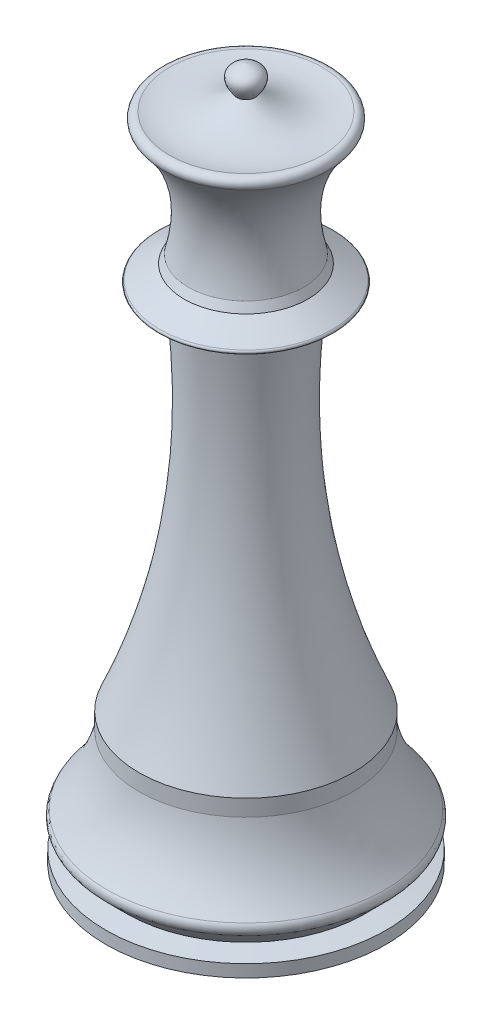
ISO-10303-21;
HEADER;
FILE_DESCRIPTION(('STEP AP214'),'2;1');
FILE_NAME('part.step','',(''),(''),'','','');
FILE_SCHEMA(('AUTOMOTIVE_DESIGN { 1 0 10303 214 1 1 1 1 }'));
ENDSEC;
DATA;
#1=APPLICATION_CONTEXT('core data for automotive mechanical design processes');
#2=APPLICATION_PROTOCOL_DEFINITION('international standard','automotive_design',2000,#1);
#3=PRODUCT_CONTEXT('',#1,'mechanical');
#4=PRODUCT('Part','Part','',(#3));
#5=PRODUCT_RELATED_PRODUCT_CATEGORY('part','',(#4));
#6=PRODUCT_DEFINITION_FORMATION('','',#4);
#7=PRODUCT_DEFINITION_CONTEXT('part definition',#1,'design');
#8=PRODUCT_DEFINITION('design','',#6,#7);
#9=PRODUCT_DEFINITION_SHAPE('','',#8);
#10=(LENGTH_UNIT() NAMED_UNIT(*) SI_UNIT(.MILLI.,.METRE.));
#11=(NAMED_UNIT(*) PLANE_ANGLE_UNIT() SI_UNIT($,.RADIAN.));
#12=(NAMED_UNIT(*) SI_UNIT($,.STERADIAN.) SOLID_ANGLE_UNIT());
#13=UNCERTAINTY_MEASURE_WITH_UNIT(LENGTH_MEASURE(1.E-05),#10,'distance_accuracy_value','');
#14=(GEOMETRIC_REPRESENTATION_CONTEXT(3) GLOBAL_UNCERTAINTY_ASSIGNED_CONTEXT((#13)) GLOBAL_UNIT_ASSIGNED_CONTEXT((#10,
#11,#12)) REPRESENTATION_CONTEXT('',''));
#15=CARTESIAN_POINT('',(0.,0.,0.));
#16=DIRECTION('',(0.,0.,1.));
#17=DIRECTION('',(1.,0.,0.));
#18=AXIS2_PLACEMENT_3D('',#15,#16,#17);
#19=CARTESIAN_POINT('',(1.13326062966833,81.,0.));
#20=CARTESIAN_POINT('',(3.02648487700527,83.4155625241193,0.));
#21=CARTESIAN_POINT('',(0.,84.,0.));
#22=B_SPLINE_CURVE_WITH_KNOTS('',2,(#19,#20,#21),.UNSPECIFIED.,.F.,.F.,(3,3),(0.,1.),.UNSPECIFIED.);
#23=CARTESIAN_POINT('',(0.,84.,0.));
#24=DIRECTION('',(0.,1.,0.));
#25=AXIS1_PLACEMENT('',#23,#24);
#26=SURFACE_OF_REVOLUTION('',#22,#25);
#27=CARTESIAN_POINT('',(0.,84.,0.));
#28=VERTEX_POINT('',#27);
#29=VERTEX_LOOP('',#28);
#30=FACE_BOUND('',#29,.T.);
#31=CARTESIAN_POINT('',(0.,81.,0.));
#32=DIRECTION('',(0.,1.,0.));
#33=DIRECTION('',(0.,0.,1.));
#34=AXIS2_PLACEMENT_3D('',#31,#32,#33);
#35=CIRCLE('',#34,1.13326062966833);
#36=CARTESIAN_POINT('',(0.,81.,1.13326062966833));
#37=VERTEX_POINT('',#36);
#38=EDGE_CURVE('E48',#37,#37,#35,.T.);
#39=ORIENTED_EDGE('',*,*,#38,.T.);
#40=EDGE_LOOP('',(#39));
#41=FACE_BOUND('',#40,.T.);
#42=ADVANCED_FACE('F32',(#30,#41),#26,.T.);
#43=CARTESIAN_POINT('',(13.,80.5,0.));
#44=CARTESIAN_POINT('',(6.49584409705784,76.7584111276341,0.));
#45=CARTESIAN_POINT('',(1.13326062966833,81.,0.));
#46=B_SPLINE_CURVE_WITH_KNOTS('',2,(#43,#44,#45),.UNSPECIFIED.,.F.,.F.,(3,3),(0.,1.),.UNSPECIFIED.);
#47=CARTESIAN_POINT('',(0.,84.,0.));
#48=DIRECTION('',(0.,1.,0.));
#49=AXIS1_PLACEMENT('',#47,#48);
#50=SURFACE_OF_REVOLUTION('',#46,#49);
#51=CARTESIAN_POINT('',(0.,78.9865391520286,0.));
#52=DIRECTION('',(0.,1.,0.));
#53=DIRECTION('',(0.,0.,1.));
#54=AXIS2_PLACEMENT_3D('',#51,#52,#53);
#55=CIRCLE('',#54,9.25895814437027);
#56=CARTESIAN_POINT('',(0.,78.9865391520286,9.25895814437027));
#57=VERTEX_POINT('',#56);
#58=EDGE_CURVE('E63',#57,#57,#55,.T.);
#59=ORIENTED_EDGE('',*,*,#58,.T.);
#60=EDGE_LOOP('',(#59));
#61=FACE_BOUND('',#60,.T.);
#62=ORIENTED_EDGE('',*,*,#38,.F.);
#63=EDGE_LOOP('',(#62));
#64=FACE_BOUND('',#63,.T.);
#65=ADVANCED_FACE('F44',(#61,#64),#50,.T.);
#66=CARTESIAN_POINT('',(7.,64.,0.));
#67=CARTESIAN_POINT('',(4.39649003097827,74.0702511156848,0.));
#68=CARTESIAN_POINT('',(13.,80.5,0.));
#69=B_SPLINE_CURVE_WITH_KNOTS('',2,(#66,#67,#68),.UNSPECIFIED.,.F.,.F.,(3,3),(0.,1.),.UNSPECIFIED.);
#70=CARTESIAN_POINT('',(0.,84.,0.));
#71=DIRECTION('',(0.,1.,0.));
#72=AXIS1_PLACEMENT('',#70,#71);
#73=SURFACE_OF_REVOLUTION('',#69,#72);
#74=CARTESIAN_POINT('',(0.,77.7576022569432,0.));
#75=DIRECTION('',(0.,1.,0.));
#76=DIRECTION('',(0.,0.,1.));
#77=AXIS2_PLACEMENT_3D('',#74,#75,#76);
#78=CIRCLE('',#77,9.98480800543243);
#79=CARTESIAN_POINT('',(0.,77.7576022569432,9.98480800543243));
#80=VERTEX_POINT('',#79);
#81=EDGE_CURVE('E66',#80,#80,#78,.F.);
#82=ORIENTED_EDGE('',*,*,#81,.T.);
#83=EDGE_LOOP('',(#82));
#84=FACE_BOUND('',#83,.T.);
#85=CARTESIAN_POINT('',(0.,64.,0.));
#86=DIRECTION('',(0.,1.,0.));
#87=DIRECTION('',(0.,0.,1.));
#88=AXIS2_PLACEMENT_3D('',#85,#86,#87);
#89=CIRCLE('',#88,7.);
#90=CARTESIAN_POINT('',(0.,64.,7.));
#91=VERTEX_POINT('',#90);
#92=EDGE_CURVE('E51',#91,#91,#89,.T.);
#93=ORIENTED_EDGE('',*,*,#92,.T.);
#94=EDGE_LOOP('',(#93));
#95=FACE_BOUND('',#94,.T.);
#96=ADVANCED_FACE('F173',(#84,#95),#73,.T.);
#97=CARTESIAN_POINT('',(0.,63.,0.));
#98=DIRECTION('',(0.,-1.,0.));
#99=DIRECTION('',(0.,0.,-1.));
#100=AXIS2_PLACEMENT_3D('',#97,#98,#99);
#101=CONICAL_SURFACE('',#100,7.5,0.463647609000805);
#102=ORIENTED_EDGE('',*,*,#92,.F.);
#103=EDGE_LOOP('',(#102));
#104=FACE_BOUND('',#103,.T.);
#105=CARTESIAN_POINT('',(0.,63.,0.));
#106=DIRECTION('',(0.,1.,0.));
#107=DIRECTION('',(0.,0.,1.));
#108=AXIS2_PLACEMENT_3D('',#105,#106,#107);
#109=CIRCLE('',#108,7.5);
#110=CARTESIAN_POINT('',(0.,63.,7.5));
#111=VERTEX_POINT('',#110);
#112=EDGE_CURVE('E57',#111,#111,#109,.T.);
#113=ORIENTED_EDGE('',*,*,#112,.T.);
#114=EDGE_LOOP('',(#113));
#115=FACE_BOUND('',#114,.T.);
#116=ADVANCED_FACE('F176',(#104,#115),#101,.T.);
#117=CARTESIAN_POINT('',(0.,61.,0.));
#118=DIRECTION('',(0.,-1.,0.));
#119=DIRECTION('',(0.,0.,-1.));
#120=AXIS2_PLACEMENT_3D('',#117,#118,#119);
#121=CONICAL_SURFACE('',#120,11.,1.05165021254837);
#122=CARTESIAN_POINT('',(0.,61.3086930111199,0.));
#123=DIRECTION('',(0.,1.,0.));
#124=DIRECTION('',(0.,0.,1.));
#125=AXIS2_PLACEMENT_3D('',#122,#123,#124);
#126=CIRCLE('',#125,10.4597872305401);
#127=CARTESIAN_POINT('',(0.,61.3086930111199,10.4597872305401));
#128=VERTEX_POINT('',#127);
#129=EDGE_CURVE('E39',#128,#128,#126,.T.);
#130=ORIENTED_EDGE('',*,*,#129,.T.);
#131=EDGE_LOOP('',(#130));
#132=FACE_BOUND('',#131,.T.);
#133=ORIENTED_EDGE('',*,*,#112,.F.);
#134=EDGE_LOOP('',(#133));
#135=FACE_BOUND('',#134,.T.);
#136=ADVANCED_FACE('F71',(#132,#135),#121,.T.);
#137=CARTESIAN_POINT('',(0.,60.,0.));
#138=DIRECTION('',(0.,1.,0.));
#139=DIRECTION('',(0.,0.,1.));
#140=AXIS2_PLACEMENT_3D('',#137,#138,#139);
#141=CONICAL_SURFACE('',#140,7.,1.32581766366803);
#142=CARTESIAN_POINT('',(0.,60.8490966005525,0.));
#143=DIRECTION('',(0.,-1.,0.));
#144=DIRECTION('',(0.,0.,-1.));
#145=AXIS2_PLACEMENT_3D('',#142,#143,#144);
#146=CIRCLE('',#145,10.39638640221);
#147=CARTESIAN_POINT('',(0.,60.8490966005525,-10.39638640221));
#148=VERTEX_POINT('',#147);
#149=EDGE_CURVE('E11',#148,#148,#146,.T.);
#150=ORIENTED_EDGE('',*,*,#149,.T.);
#151=EDGE_LOOP('',(#150));
#152=FACE_BOUND('',#151,.T.);
#153=CARTESIAN_POINT('',(0.,60.,0.));
#154=DIRECTION('',(0.,1.,0.));
#155=DIRECTION('',(0.,0.,1.));
#156=AXIS2_PLACEMENT_3D('',#153,#154,#155);
#157=CIRCLE('',#156,7.);
#158=CARTESIAN_POINT('',(0.,60.,7.));
#159=VERTEX_POINT('',#158);
#160=EDGE_CURVE('E91',#159,#159,#157,.T.);
#161=ORIENTED_EDGE('',*,*,#160,.T.);
#162=EDGE_LOOP('',(#161));
#163=FACE_BOUND('',#162,.T.);
#164=ADVANCED_FACE('F84',(#152,#163),#141,.T.);
#165=CARTESIAN_POINT('',(12.9764118594457,16.03,0.));
#166=CARTESIAN_POINT('',(4.13602827579343,36.5953595125436,0.));
#167=CARTESIAN_POINT('',(7.,60.,0.));
#168=B_SPLINE_CURVE_WITH_KNOTS('',2,(#165,#166,#167),.UNSPECIFIED.,.F.,.F.,(3,3),(0.,1.),.UNSPECIFIED.);
#169=CARTESIAN_POINT('',(0.,84.,0.));
#170=DIRECTION('',(0.,1.,0.));
#171=AXIS1_PLACEMENT('',#169,#170);
#172=SURFACE_OF_REVOLUTION('',#168,#171);
#173=ORIENTED_EDGE('',*,*,#160,.F.);
#174=EDGE_LOOP('',(#173));
#175=FACE_BOUND('',#174,.T.);
#176=CARTESIAN_POINT('',(0.,16.03,0.));
#177=DIRECTION('',(0.,1.,0.));
#178=DIRECTION('',(0.,0.,1.));
#179=AXIS2_PLACEMENT_3D('',#176,#177,#178);
#180=CIRCLE('',#179,12.9764118594457);
#181=CARTESIAN_POINT('',(0.,16.03,12.9764118594457));
#182=VERTEX_POINT('',#181);
#183=EDGE_CURVE('E93',#182,#182,#180,.T.);
#184=ORIENTED_EDGE('',*,*,#183,.T.);
#185=EDGE_LOOP('',(#184));
#186=FACE_BOUND('',#185,.T.);
#187=ADVANCED_FACE('F87',(#175,#186),#172,.T.);
#188=CARTESIAN_POINT('',(0.,84.,0.));
#189=DIRECTION('',(0.,1.,0.));
#190=DIRECTION('',(0.,0.,1.));
#191=AXIS2_PLACEMENT_3D('',#188,#189,#190);
#192=CYLINDRICAL_SURFACE('',#191,12.9764118594457);
#193=ORIENTED_EDGE('',*,*,#183,.F.);
#194=EDGE_LOOP('',(#193));
#195=FACE_BOUND('',#194,.T.);
#196=CARTESIAN_POINT('',(0.,14.03,0.));
#197=DIRECTION('',(0.,1.,0.));
#198=DIRECTION('',(0.,0.,1.));
#199=AXIS2_PLACEMENT_3D('',#196,#197,#198);
#200=CIRCLE('',#199,12.9764118594457);
#201=CARTESIAN_POINT('',(0.,14.03,12.9764118594457));
#202=VERTEX_POINT('',#201);
#203=EDGE_CURVE('E97',#202,#202,#200,.T.);
#204=ORIENTED_EDGE('',*,*,#203,.T.);
#205=EDGE_LOOP('',(#204));
#206=FACE_BOUND('',#205,.T.);
#207=ADVANCED_FACE('F142',(#195,#206),#192,.T.);
#208=CARTESIAN_POINT('',(17.5,5.,0.));
#209=CARTESIAN_POINT('',(13.9021176592597,8.73756245356651,0.));
#210=CARTESIAN_POINT('',(12.9764118594457,14.03,0.));
#211=B_SPLINE_CURVE_WITH_KNOTS('',2,(#208,#209,#210),.UNSPECIFIED.,.F.,.F.,(3,3),(0.,1.),.UNSPECIFIED.);
#212=CARTESIAN_POINT('',(0.,84.,0.));
#213=DIRECTION('',(0.,1.,0.));
#214=AXIS1_PLACEMENT('',#212,#213);
#215=SURFACE_OF_REVOLUTION('',#211,#214);
#216=CARTESIAN_POINT('',(0.,5.6861045276058,0.));
#217=DIRECTION('',(0.,1.,0.));
#218=DIRECTION('',(0.,0.,1.));
#219=AXIS2_PLACEMENT_3D('',#216,#217,#218);
#220=CIRCLE('',#219,16.8733774895661);
#221=CARTESIAN_POINT('',(0.,5.6861045276058,16.8733774895661));
#222=VERTEX_POINT('',#221);
#223=EDGE_CURVE('E50',#222,#222,#220,.T.);
#224=ORIENTED_EDGE('',*,*,#223,.T.);
#225=EDGE_LOOP('',(#224));
#226=FACE_BOUND('',#225,.T.);
#227=ORIENTED_EDGE('',*,*,#203,.F.);
#228=EDGE_LOOP('',(#227));
#229=FACE_BOUND('',#228,.T.);
#230=ADVANCED_FACE('F138',(#226,#229),#215,.T.);
#231=CARTESIAN_POINT('',(0.,1.94968869268543,0.));
#232=DIRECTION('',(0.,1.,0.));
#233=DIRECTION('',(0.,0.,1.));
#234=AXIS2_PLACEMENT_3D('',#231,#232,#233);
#235=CONICAL_SURFACE('',#234,14.4496886926854,0.785398163397447);
#236=CARTESIAN_POINT('',(0.,4.3244572916715,0.));
#237=DIRECTION('',(0.,-1.,0.));
#238=DIRECTION('',(0.,0.,-1.));
#239=AXIS2_PLACEMENT_3D('',#236,#237,#238);
#240=CIRCLE('',#239,16.8244572916715);
#241=CARTESIAN_POINT('',(0.,4.3244572916715,-16.8244572916715));
#242=VERTEX_POINT('',#241);
#243=EDGE_CURVE('E54',#242,#242,#240,.T.);
#244=ORIENTED_EDGE('',*,*,#243,.T.);
#245=EDGE_LOOP('',(#244));
#246=FACE_BOUND('',#245,.T.);
#247=CARTESIAN_POINT('',(0.,1.94968869268543,0.));
#248=DIRECTION('',(0.,1.,0.));
#249=DIRECTION('',(0.,0.,1.));
#250=AXIS2_PLACEMENT_3D('',#247,#248,#249);
#251=CIRCLE('',#250,14.4496886926854);
#252=CARTESIAN_POINT('',(0.,1.94968869268543,14.4496886926854));
#253=VERTEX_POINT('',#252);
#254=EDGE_CURVE('E102',#253,#253,#251,.T.);
#255=ORIENTED_EDGE('',*,*,#254,.T.);
#256=EDGE_LOOP('',(#255));
#257=FACE_BOUND('',#256,.T.);
#258=ADVANCED_FACE('F141',(#246,#257),#235,.T.);
#259=CARTESIAN_POINT('',(0.,1.5,0.));
#260=DIRECTION('',(0.,-1.,0.));
#261=DIRECTION('',(0.,0.,-1.));
#262=AXIS2_PLACEMENT_3D('',#259,#260,#261);
#263=CONICAL_SURFACE('',#262,17.,1.39626340159547);
#264=ORIENTED_EDGE('',*,*,#254,.F.);
#265=EDGE_LOOP('',(#264));
#266=FACE_BOUND('',#265,.T.);
#267=CARTESIAN_POINT('',(0.,1.5,0.));
#268=DIRECTION('',(0.,1.,0.));
#269=DIRECTION('',(0.,0.,1.));
#270=AXIS2_PLACEMENT_3D('',#267,#268,#269);
#271=CIRCLE('',#270,17.);
#272=CARTESIAN_POINT('',(0.,1.5,17.));
#273=VERTEX_POINT('',#272);
#274=EDGE_CURVE('E105',#273,#273,#271,.T.);
#275=ORIENTED_EDGE('',*,*,#274,.T.);
#276=EDGE_LOOP('',(#275));
#277=FACE_BOUND('',#276,.T.);
#278=ADVANCED_FACE('F207',(#266,#277),#263,.T.);
#279=CARTESIAN_POINT('',(0.,84.,0.));
#280=DIRECTION('',(0.,1.,0.));
#281=DIRECTION('',(0.,0.,1.));
#282=AXIS2_PLACEMENT_3D('',#279,#280,#281);
#283=CYLINDRICAL_SURFACE('',#282,17.);
#284=ORIENTED_EDGE('',*,*,#274,.F.);
#285=EDGE_LOOP('',(#284));
#286=FACE_BOUND('',#285,.T.);
#287=CARTESIAN_POINT('',(0.,0.,0.));
#288=DIRECTION('',(0.,1.,0.));
#289=DIRECTION('',(0.,0.,1.));
#290=AXIS2_PLACEMENT_3D('',#287,#288,#289);
#291=CIRCLE('',#290,17.);
#292=CARTESIAN_POINT('',(0.,0.,17.));
#293=VERTEX_POINT('',#292);
#294=EDGE_CURVE('E108',#293,#293,#291,.T.);
#295=ORIENTED_EDGE('',*,*,#294,.T.);
#296=EDGE_LOOP('',(#295));
#297=FACE_BOUND('',#296,.T.);
#298=ADVANCED_FACE('F131',(#286,#297),#283,.T.);
#299=CARTESIAN_POINT('',(0.,0.,0.));
#300=DIRECTION('',(0.,1.,0.));
#301=DIRECTION('',(0.,0.,1.));
#302=AXIS2_PLACEMENT_3D('',#299,#300,#301);
#303=PLANE('',#302);
#304=ORIENTED_EDGE('',*,*,#294,.F.);
#305=EDGE_LOOP('',(#304));
#306=FACE_BOUND('',#305,.T.);
#307=ADVANCED_FACE('F126',(#306),#303,.F.);
#308=CARTESIAN_POINT('',(0.,5.03156407285805,0.));
#309=DIRECTION('',(0.,-1.,0.));
#310=DIRECTION('',(0.,0.,-1.));
#311=AXIS2_PLACEMENT_3D('',#308,#309,#310);
#312=TOROIDAL_SURFACE('',#311,16.1173505104849,1.);
#313=ORIENTED_EDGE('',*,*,#243,.F.);
#314=EDGE_LOOP('',(#313));
#315=FACE_BOUND('',#314,.T.);
#316=ORIENTED_EDGE('',*,*,#223,.F.);
#317=EDGE_LOOP('',(#316));
#318=FACE_BOUND('',#317,.T.);
#319=ADVANCED_FACE('F80',(#315,#318),#312,.T.);
#320=CARTESIAN_POINT('',(0.,78.2547569364531,0.));
#321=DIRECTION('',(0.,-1.,0.));
#322=DIRECTION('',(0.,0.,-1.));
#323=AXIS2_PLACEMENT_3D('',#320,#321,#322);
#324=TOROIDAL_SURFACE('',#323,9.42325905419002,0.75);
#325=ORIENTED_EDGE('',*,*,#81,.F.);
#326=EDGE_LOOP('',(#325));
#327=FACE_BOUND('',#326,.T.);
#328=ORIENTED_EDGE('',*,*,#58,.F.);
#329=EDGE_LOOP('',(#328));
#330=FACE_BOUND('',#329,.T.);
#331=ADVANCED_FACE('F75',(#327,#330),#324,.T.);
#332=CARTESIAN_POINT('',(0.,61.0916322255888,0.));
#333=DIRECTION('',(0.,-1.,0.));
#334=DIRECTION('',(0.,0.,-1.));
#335=AXIS2_PLACEMENT_3D('',#332,#333,#334);
#336=TOROIDAL_SURFACE('',#335,10.3357524959509,0.25);
#337=ORIENTED_EDGE('',*,*,#149,.F.);
#338=EDGE_LOOP('',(#337));
#339=FACE_BOUND('',#338,.T.);
#340=ORIENTED_EDGE('',*,*,#129,.F.);
#341=EDGE_LOOP('',(#340));
#342=FACE_BOUND('',#341,.T.);
#343=ADVANCED_FACE('F34',(#339,#342),#336,.T.);
#344=CLOSED_SHELL('',(#42,#65,#96,#116,#136,#164,#187,#207,#230,#258,#278,#298,#307,#319,#331,#343));
#345=MANIFOLD_SOLID_BREP('B2',#344);
#346=ADVANCED_BREP_SHAPE_REPRESENTATION('',(#18,#345),#14);
#347=SHAPE_DEFINITION_REPRESENTATION(#9,#346);
ENDSEC;
END-ISO-10303-21;
